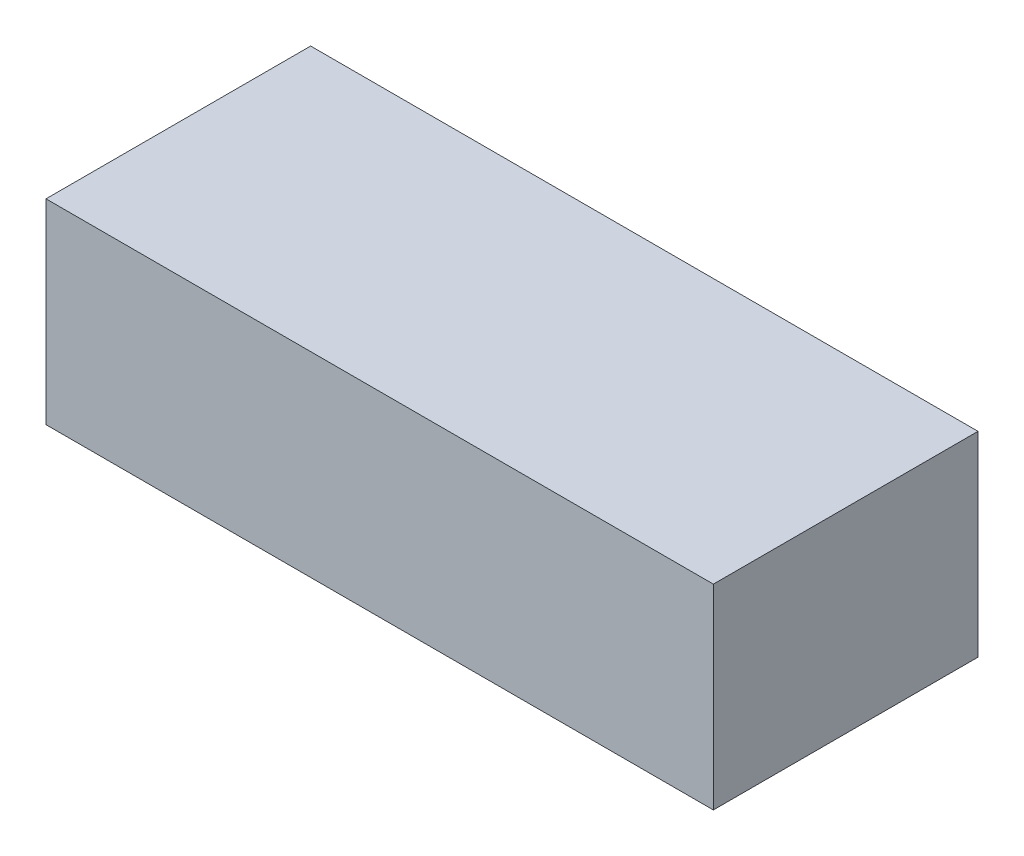
ISO-10303-21;
HEADER;
FILE_DESCRIPTION(('STEP AP214'),'2;1');
FILE_NAME('part.step','',(''),(''),'','','');
FILE_SCHEMA(('AUTOMOTIVE_DESIGN { 1 0 10303 214 1 1 1 1 }'));
ENDSEC;
DATA;
#1=APPLICATION_CONTEXT('core data for automotive mechanical design processes');
#2=APPLICATION_PROTOCOL_DEFINITION('international standard','automotive_design',2000,#1);
#3=PRODUCT_CONTEXT('',#1,'mechanical');
#4=PRODUCT('Part','Part','',(#3));
#5=PRODUCT_RELATED_PRODUCT_CATEGORY('part','',(#4));
#6=PRODUCT_DEFINITION_FORMATION('','',#4);
#7=PRODUCT_DEFINITION_CONTEXT('part definition',#1,'design');
#8=PRODUCT_DEFINITION('design','',#6,#7);
#9=PRODUCT_DEFINITION_SHAPE('','',#8);
#10=(LENGTH_UNIT() NAMED_UNIT(*) SI_UNIT(.MILLI.,.METRE.));
#11=(NAMED_UNIT(*) PLANE_ANGLE_UNIT() SI_UNIT($,.RADIAN.));
#12=(NAMED_UNIT(*) SI_UNIT($,.STERADIAN.) SOLID_ANGLE_UNIT());
#13=UNCERTAINTY_MEASURE_WITH_UNIT(LENGTH_MEASURE(1.E-05),#10,'distance_accuracy_value','');
#14=(GEOMETRIC_REPRESENTATION_CONTEXT(3) GLOBAL_UNCERTAINTY_ASSIGNED_CONTEXT((#13)) GLOBAL_UNIT_ASSIGNED_CONTEXT((#10,
#11,#12)) REPRESENTATION_CONTEXT('',''));
#15=CARTESIAN_POINT('',(0.,0.,0.));
#16=DIRECTION('',(0.,0.,1.));
#17=DIRECTION('',(1.,0.,0.));
#18=AXIS2_PLACEMENT_3D('',#15,#16,#17);
#19=CARTESIAN_POINT('',(0.,0.,-23.));
#20=DIRECTION('',(-1.,0.,0.));
#21=DIRECTION('',(0.,0.,1.));
#22=AXIS2_PLACEMENT_3D('',#19,#20,#21);
#23=PLANE('',#22);
#24=DIRECTION('',(0.,-1.,0.));
#25=VECTOR('',#24,1.);
#26=CARTESIAN_POINT('',(0.,0.,0.));
#27=LINE('',#26,#25);
#28=CARTESIAN_POINT('',(0.,17.,0.));
#29=VERTEX_POINT('',#28);
#30=CARTESIAN_POINT('',(0.,0.,0.));
#31=VERTEX_POINT('',#30);
#32=EDGE_CURVE('E97',#29,#31,#27,.T.);
#33=ORIENTED_EDGE('',*,*,#32,.F.);
#34=DIRECTION('',(0.,0.,1.));
#35=VECTOR('',#34,1.);
#36=CARTESIAN_POINT('',(0.,17.,-23.));
#37=LINE('',#36,#35);
#38=CARTESIAN_POINT('',(0.,17.,-23.));
#39=VERTEX_POINT('',#38);
#40=EDGE_CURVE('E11',#39,#29,#37,.T.);
#41=ORIENTED_EDGE('',*,*,#40,.F.);
#42=DIRECTION('',(0.,-1.,0.));
#43=VECTOR('',#42,1.);
#44=CARTESIAN_POINT('',(0.,0.,-23.));
#45=LINE('',#44,#43);
#46=CARTESIAN_POINT('',(0.,0.,-23.));
#47=VERTEX_POINT('',#46);
#48=EDGE_CURVE('E91',#39,#47,#45,.T.);
#49=ORIENTED_EDGE('',*,*,#48,.T.);
#50=DIRECTION('',(0.,0.,1.));
#51=VECTOR('',#50,1.);
#52=CARTESIAN_POINT('',(0.,0.,-23.));
#53=LINE('',#52,#51);
#54=EDGE_CURVE('E36',#47,#31,#53,.T.);
#55=ORIENTED_EDGE('',*,*,#54,.T.);
#56=EDGE_LOOP('',(#33,#41,#49,#55));
#57=FACE_BOUND('',#56,.T.);
#58=ADVANCED_FACE('F33',(#57),#23,.T.);
#59=CARTESIAN_POINT('',(0.,17.,-23.));
#60=DIRECTION('',(0.,1.,0.));
#61=DIRECTION('',(0.,0.,1.));
#62=AXIS2_PLACEMENT_3D('',#59,#60,#61);
#63=PLANE('',#62);
#64=DIRECTION('',(-1.,0.,0.));
#65=VECTOR('',#64,1.);
#66=CARTESIAN_POINT('',(0.,17.,0.));
#67=LINE('',#66,#65);
#68=CARTESIAN_POINT('',(58.,17.,0.));
#69=VERTEX_POINT('',#68);
#70=EDGE_CURVE('E93',#69,#29,#67,.T.);
#71=ORIENTED_EDGE('',*,*,#70,.F.);
#72=DIRECTION('',(0.,0.,1.));
#73=VECTOR('',#72,1.);
#74=CARTESIAN_POINT('',(58.,17.,-23.));
#75=LINE('',#74,#73);
#76=CARTESIAN_POINT('',(58.,17.,-23.));
#77=VERTEX_POINT('',#76);
#78=EDGE_CURVE('E42',#77,#69,#75,.T.);
#79=ORIENTED_EDGE('',*,*,#78,.F.);
#80=DIRECTION('',(-1.,0.,0.));
#81=VECTOR('',#80,1.);
#82=CARTESIAN_POINT('',(0.,17.,-23.));
#83=LINE('',#82,#81);
#84=EDGE_CURVE('E88',#77,#39,#83,.T.);
#85=ORIENTED_EDGE('',*,*,#84,.T.);
#86=ORIENTED_EDGE('',*,*,#40,.T.);
#87=EDGE_LOOP('',(#71,#79,#85,#86));
#88=FACE_BOUND('',#87,.T.);
#89=ADVANCED_FACE('F107',(#88),#63,.T.);
#90=CARTESIAN_POINT('',(58.,0.,-23.));
#91=DIRECTION('',(1.,0.,0.));
#92=DIRECTION('',(0.,0.,-1.));
#93=AXIS2_PLACEMENT_3D('',#90,#91,#92);
#94=PLANE('',#93);
#95=DIRECTION('',(0.,1.,0.));
#96=VECTOR('',#95,1.);
#97=CARTESIAN_POINT('',(58.,0.,0.));
#98=LINE('',#97,#96);
#99=CARTESIAN_POINT('',(58.,0.,0.));
#100=VERTEX_POINT('',#99);
#101=EDGE_CURVE('E83',#100,#69,#98,.T.);
#102=ORIENTED_EDGE('',*,*,#101,.F.);
#103=DIRECTION('',(0.,0.,1.));
#104=VECTOR('',#103,1.);
#105=CARTESIAN_POINT('',(58.,0.,-23.));
#106=LINE('',#105,#104);
#107=CARTESIAN_POINT('',(58.,0.,-23.));
#108=VERTEX_POINT('',#107);
#109=EDGE_CURVE('E78',#108,#100,#106,.T.);
#110=ORIENTED_EDGE('',*,*,#109,.F.);
#111=DIRECTION('',(0.,1.,0.));
#112=VECTOR('',#111,1.);
#113=CARTESIAN_POINT('',(58.,0.,-23.));
#114=LINE('',#113,#112);
#115=EDGE_CURVE('E81',#108,#77,#114,.T.);
#116=ORIENTED_EDGE('',*,*,#115,.T.);
#117=ORIENTED_EDGE('',*,*,#78,.T.);
#118=EDGE_LOOP('',(#102,#110,#116,#117));
#119=FACE_BOUND('',#118,.T.);
#120=ADVANCED_FACE('F80',(#119),#94,.T.);
#121=CARTESIAN_POINT('',(0.,0.,-23.));
#122=DIRECTION('',(0.,-1.,0.));
#123=DIRECTION('',(0.,0.,-1.));
#124=AXIS2_PLACEMENT_3D('',#121,#122,#123);
#125=PLANE('',#124);
#126=DIRECTION('',(1.,0.,0.));
#127=VECTOR('',#126,1.);
#128=CARTESIAN_POINT('',(0.,0.,0.));
#129=LINE('',#128,#127);
#130=EDGE_CURVE('E100',#31,#100,#129,.T.);
#131=ORIENTED_EDGE('',*,*,#130,.F.);
#132=ORIENTED_EDGE('',*,*,#54,.F.);
#133=DIRECTION('',(1.,0.,0.));
#134=VECTOR('',#133,1.);
#135=CARTESIAN_POINT('',(0.,0.,-23.));
#136=LINE('',#135,#134);
#137=EDGE_CURVE('E87',#47,#108,#136,.T.);
#138=ORIENTED_EDGE('',*,*,#137,.T.);
#139=ORIENTED_EDGE('',*,*,#109,.T.);
#140=EDGE_LOOP('',(#131,#132,#138,#139));
#141=FACE_BOUND('',#140,.T.);
#142=ADVANCED_FACE('F90',(#141),#125,.T.);
#143=CARTESIAN_POINT('',(0.,0.,-23.));
#144=DIRECTION('',(0.,0.,-1.));
#145=DIRECTION('',(-1.,0.,0.));
#146=AXIS2_PLACEMENT_3D('',#143,#144,#145);
#147=PLANE('',#146);
#148=ORIENTED_EDGE('',*,*,#48,.F.);
#149=ORIENTED_EDGE('',*,*,#84,.F.);
#150=ORIENTED_EDGE('',*,*,#115,.F.);
#151=ORIENTED_EDGE('',*,*,#137,.F.);
#152=EDGE_LOOP('',(#148,#149,#150,#151));
#153=FACE_BOUND('',#152,.T.);
#154=ADVANCED_FACE('F86',(#153),#147,.T.);
#155=CARTESIAN_POINT('',(0.,0.,0.));
#156=DIRECTION('',(0.,0.,-1.));
#157=DIRECTION('',(-1.,0.,0.));
#158=AXIS2_PLACEMENT_3D('',#155,#156,#157);
#159=PLANE('',#158);
#160=ORIENTED_EDGE('',*,*,#32,.T.);
#161=ORIENTED_EDGE('',*,*,#130,.T.);
#162=ORIENTED_EDGE('',*,*,#101,.T.);
#163=ORIENTED_EDGE('',*,*,#70,.T.);
#164=EDGE_LOOP('',(#160,#161,#162,#163));
#165=FACE_BOUND('',#164,.T.);
#166=ADVANCED_FACE('F106',(#165),#159,.F.);
#167=CLOSED_SHELL('',(#58,#89,#120,#142,#154,#166));
#168=MANIFOLD_SOLID_BREP('B2',#167);
#169=ADVANCED_BREP_SHAPE_REPRESENTATION('',(#18,#168),#14);
#170=SHAPE_DEFINITION_REPRESENTATION(#9,#169);
ENDSEC;
END-ISO-10303-21;
